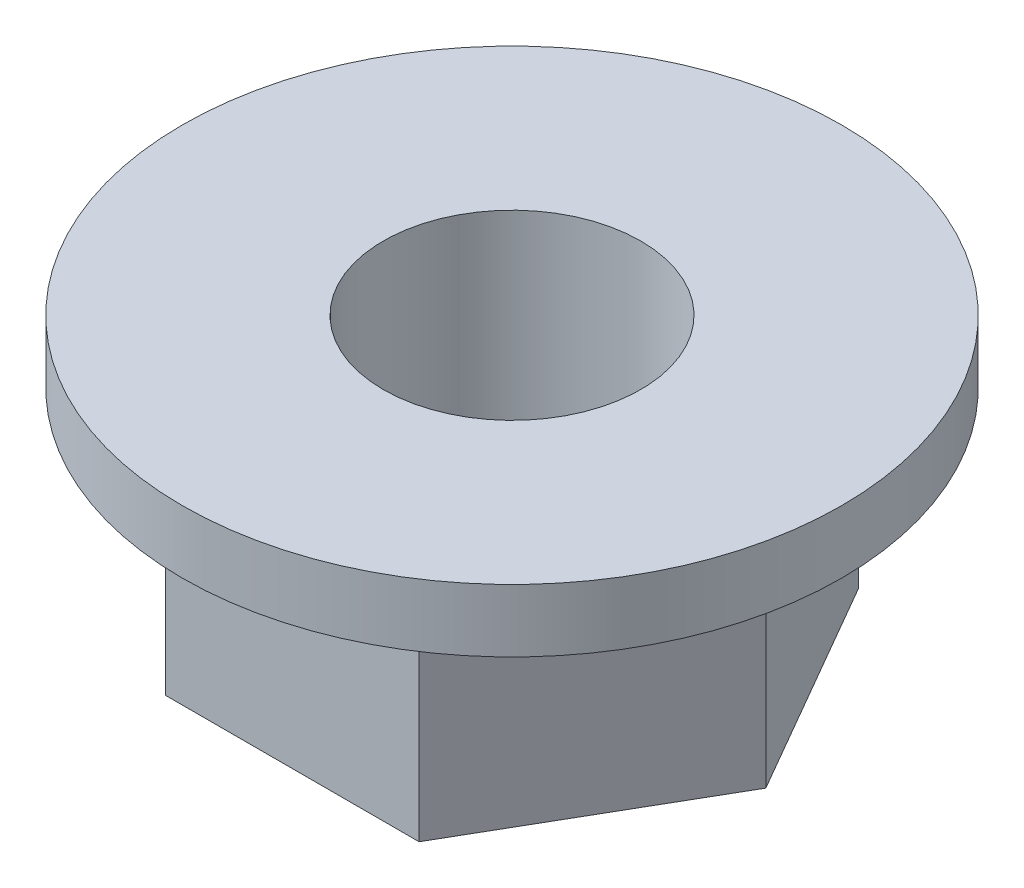
ISO-10303-21;
HEADER;
FILE_DESCRIPTION(('STEP AP214'),'2;1');
FILE_NAME('part.step','',(''),(''),'','','');
FILE_SCHEMA(('AUTOMOTIVE_DESIGN { 1 0 10303 214 1 1 1 1 }'));
ENDSEC;
DATA;
#1=APPLICATION_CONTEXT('core data for automotive mechanical design processes');
#2=APPLICATION_PROTOCOL_DEFINITION('international standard','automotive_design',2000,#1);
#3=PRODUCT_CONTEXT('',#1,'mechanical');
#4=PRODUCT('Part','Part','',(#3));
#5=PRODUCT_RELATED_PRODUCT_CATEGORY('part','',(#4));
#6=PRODUCT_DEFINITION_FORMATION('','',#4);
#7=PRODUCT_DEFINITION_CONTEXT('part definition',#1,'design');
#8=PRODUCT_DEFINITION('design','',#6,#7);
#9=PRODUCT_DEFINITION_SHAPE('','',#8);
#10=(LENGTH_UNIT() NAMED_UNIT(*) SI_UNIT(.MILLI.,.METRE.));
#11=(NAMED_UNIT(*) PLANE_ANGLE_UNIT() SI_UNIT($,.RADIAN.));
#12=(NAMED_UNIT(*) SI_UNIT($,.STERADIAN.) SOLID_ANGLE_UNIT());
#13=UNCERTAINTY_MEASURE_WITH_UNIT(LENGTH_MEASURE(1.E-05),#10,'distance_accuracy_value','');
#14=(GEOMETRIC_REPRESENTATION_CONTEXT(3) GLOBAL_UNCERTAINTY_ASSIGNED_CONTEXT((#13)) GLOBAL_UNIT_ASSIGNED_CONTEXT((#10,
#11,#12)) REPRESENTATION_CONTEXT('',''));
#15=CARTESIAN_POINT('',(0.,0.,0.));
#16=DIRECTION('',(0.,0.,1.));
#17=DIRECTION('',(1.,0.,0.));
#18=AXIS2_PLACEMENT_3D('',#15,#16,#17);
#19=CARTESIAN_POINT('',(-18.2709253038248,-135.,-3.5));
#20=DIRECTION('',(-0.866025403784438,0.,0.5));
#21=DIRECTION('',(0.5,0.,0.866025403784439));
#22=AXIS2_PLACEMENT_3D('',#19,#20,#21);
#23=PLANE('',#22);
#24=DIRECTION('',(-0.5,0.,-0.866025403784439));
#25=VECTOR('',#24,1.);
#26=CARTESIAN_POINT('',(-18.2709253038248,-138.5,-3.5));
#27=LINE('',#26,#25);
#28=CARTESIAN_POINT('',(-16.2501993616611,-138.5,0.));
#29=VERTEX_POINT('',#28);
#30=CARTESIAN_POINT('',(-18.2709253038248,-138.5,-3.5));
#31=VERTEX_POINT('',#30);
#32=EDGE_CURVE('E131',#29,#31,#27,.T.);
#33=ORIENTED_EDGE('',*,*,#32,.T.);
#34=DIRECTION('',(0.,-1.,0.));
#35=VECTOR('',#34,1.);
#36=CARTESIAN_POINT('',(-18.2709253038248,-135.,-3.5));
#37=LINE('',#36,#35);
#38=CARTESIAN_POINT('',(-18.2709253038248,-135.,-3.5));
#39=VERTEX_POINT('',#38);
#40=EDGE_CURVE('E11',#39,#31,#37,.T.);
#41=ORIENTED_EDGE('',*,*,#40,.F.);
#42=DIRECTION('',(-0.5,0.,-0.866025403784439));
#43=VECTOR('',#42,1.);
#44=CARTESIAN_POINT('',(-18.2709253038248,-135.,-3.5));
#45=LINE('',#44,#43);
#46=CARTESIAN_POINT('',(-16.2501993616611,-135.,0.));
#47=VERTEX_POINT('',#46);
#48=EDGE_CURVE('E123',#47,#39,#45,.T.);
#49=ORIENTED_EDGE('',*,*,#48,.F.);
#50=DIRECTION('',(0.,-1.,0.));
#51=VECTOR('',#50,1.);
#52=CARTESIAN_POINT('',(-16.2501993616611,-135.,0.));
#53=LINE('',#52,#51);
#54=EDGE_CURVE('E128',#47,#29,#53,.T.);
#55=ORIENTED_EDGE('',*,*,#54,.T.);
#56=EDGE_LOOP('',(#33,#41,#49,#55));
#57=FACE_BOUND('',#56,.T.);
#58=ADVANCED_FACE('F39',(#57),#23,.F.);
#59=CARTESIAN_POINT('',(-22.3123771881522,-135.,-3.5));
#60=DIRECTION('',(0.,0.,1.));
#61=DIRECTION('',(1.,0.,0.));
#62=AXIS2_PLACEMENT_3D('',#59,#60,#61);
#63=PLANE('',#62);
#64=DIRECTION('',(-1.,0.,0.));
#65=VECTOR('',#64,1.);
#66=CARTESIAN_POINT('',(-22.3123771881522,-138.5,-3.5));
#67=LINE('',#66,#65);
#68=CARTESIAN_POINT('',(-22.3123771881522,-138.5,-3.5));
#69=VERTEX_POINT('',#68);
#70=EDGE_CURVE('E133',#31,#69,#67,.T.);
#71=ORIENTED_EDGE('',*,*,#70,.T.);
#72=DIRECTION('',(0.,-1.,0.));
#73=VECTOR('',#72,1.);
#74=CARTESIAN_POINT('',(-22.3123771881522,-135.,-3.5));
#75=LINE('',#74,#73);
#76=CARTESIAN_POINT('',(-22.3123771881522,-135.,-3.5));
#77=VERTEX_POINT('',#76);
#78=EDGE_CURVE('E48',#77,#69,#75,.T.);
#79=ORIENTED_EDGE('',*,*,#78,.F.);
#80=DIRECTION('',(-1.,0.,0.));
#81=VECTOR('',#80,1.);
#82=CARTESIAN_POINT('',(-22.3123771881522,-135.,-3.5));
#83=LINE('',#82,#81);
#84=EDGE_CURVE('E95',#39,#77,#83,.T.);
#85=ORIENTED_EDGE('',*,*,#84,.F.);
#86=ORIENTED_EDGE('',*,*,#40,.T.);
#87=EDGE_LOOP('',(#71,#79,#85,#86));
#88=FACE_BOUND('',#87,.T.);
#89=ADVANCED_FACE('F178',(#88),#63,.F.);
#90=CARTESIAN_POINT('',(-24.3331031303159,-135.,0.));
#91=DIRECTION('',(0.866025403784439,0.,0.499999999999999));
#92=DIRECTION('',(0.499999999999999,0.,-0.866025403784439));
#93=AXIS2_PLACEMENT_3D('',#90,#91,#92);
#94=PLANE('',#93);
#95=DIRECTION('',(-0.499999999999999,0.,0.866025403784439));
#96=VECTOR('',#95,1.);
#97=CARTESIAN_POINT('',(-24.3331031303159,-138.5,0.));
#98=LINE('',#97,#96);
#99=CARTESIAN_POINT('',(-24.3331031303159,-138.5,0.));
#100=VERTEX_POINT('',#99);
#101=EDGE_CURVE('E110',#69,#100,#98,.T.);
#102=ORIENTED_EDGE('',*,*,#101,.T.);
#103=DIRECTION('',(0.,-1.,0.));
#104=VECTOR('',#103,1.);
#105=CARTESIAN_POINT('',(-24.3331031303159,-135.,0.));
#106=LINE('',#105,#104);
#107=CARTESIAN_POINT('',(-24.3331031303159,-135.,0.));
#108=VERTEX_POINT('',#107);
#109=EDGE_CURVE('E99',#108,#100,#106,.T.);
#110=ORIENTED_EDGE('',*,*,#109,.F.);
#111=DIRECTION('',(-0.499999999999999,0.,0.866025403784439));
#112=VECTOR('',#111,1.);
#113=CARTESIAN_POINT('',(-24.3331031303159,-135.,0.));
#114=LINE('',#113,#112);
#115=EDGE_CURVE('E104',#77,#108,#114,.T.);
#116=ORIENTED_EDGE('',*,*,#115,.F.);
#117=ORIENTED_EDGE('',*,*,#78,.T.);
#118=EDGE_LOOP('',(#102,#110,#116,#117));
#119=FACE_BOUND('',#118,.T.);
#120=ADVANCED_FACE('F105',(#119),#94,.F.);
#121=CARTESIAN_POINT('',(-22.3123771881522,-135.,3.5));
#122=DIRECTION('',(0.866025403784438,0.,-0.5));
#123=DIRECTION('',(-0.5,0.,-0.866025403784439));
#124=AXIS2_PLACEMENT_3D('',#121,#122,#123);
#125=PLANE('',#124);
#126=DIRECTION('',(0.5,0.,0.866025403784439));
#127=VECTOR('',#126,1.);
#128=CARTESIAN_POINT('',(-22.3123771881522,-138.5,3.5));
#129=LINE('',#128,#127);
#130=CARTESIAN_POINT('',(-22.3123771881522,-138.5,3.5));
#131=VERTEX_POINT('',#130);
#132=EDGE_CURVE('E138',#100,#131,#129,.T.);
#133=ORIENTED_EDGE('',*,*,#132,.T.);
#134=DIRECTION('',(0.,-1.,0.));
#135=VECTOR('',#134,1.);
#136=CARTESIAN_POINT('',(-22.3123771881522,-135.,3.5));
#137=LINE('',#136,#135);
#138=CARTESIAN_POINT('',(-22.3123771881522,-135.,3.5));
#139=VERTEX_POINT('',#138);
#140=EDGE_CURVE('E109',#139,#131,#137,.T.);
#141=ORIENTED_EDGE('',*,*,#140,.F.);
#142=DIRECTION('',(0.5,0.,0.866025403784439));
#143=VECTOR('',#142,1.);
#144=CARTESIAN_POINT('',(-22.3123771881522,-135.,3.5));
#145=LINE('',#144,#143);
#146=EDGE_CURVE('E114',#108,#139,#145,.T.);
#147=ORIENTED_EDGE('',*,*,#146,.F.);
#148=ORIENTED_EDGE('',*,*,#109,.T.);
#149=EDGE_LOOP('',(#133,#141,#147,#148));
#150=FACE_BOUND('',#149,.T.);
#151=ADVANCED_FACE('F111',(#150),#125,.F.);
#152=CARTESIAN_POINT('',(-18.2709253038248,-135.,3.5));
#153=DIRECTION('',(0.,0.,-1.));
#154=DIRECTION('',(-1.,0.,0.));
#155=AXIS2_PLACEMENT_3D('',#152,#153,#154);
#156=PLANE('',#155);
#157=DIRECTION('',(1.,0.,0.));
#158=VECTOR('',#157,1.);
#159=CARTESIAN_POINT('',(-18.2709253038248,-138.5,3.5));
#160=LINE('',#159,#158);
#161=CARTESIAN_POINT('',(-18.2709253038248,-138.5,3.5));
#162=VERTEX_POINT('',#161);
#163=EDGE_CURVE('E79',#131,#162,#160,.T.);
#164=ORIENTED_EDGE('',*,*,#163,.T.);
#165=DIRECTION('',(0.,-1.,0.));
#166=VECTOR('',#165,1.);
#167=CARTESIAN_POINT('',(-18.2709253038248,-135.,3.5));
#168=LINE('',#167,#166);
#169=CARTESIAN_POINT('',(-18.2709253038248,-135.,3.5));
#170=VERTEX_POINT('',#169);
#171=EDGE_CURVE('E57',#170,#162,#168,.T.);
#172=ORIENTED_EDGE('',*,*,#171,.F.);
#173=DIRECTION('',(1.,0.,0.));
#174=VECTOR('',#173,1.);
#175=CARTESIAN_POINT('',(-18.2709253038248,-135.,3.5));
#176=LINE('',#175,#174);
#177=EDGE_CURVE('E117',#139,#170,#176,.T.);
#178=ORIENTED_EDGE('',*,*,#177,.F.);
#179=ORIENTED_EDGE('',*,*,#140,.T.);
#180=EDGE_LOOP('',(#164,#172,#178,#179));
#181=FACE_BOUND('',#180,.T.);
#182=ADVANCED_FACE('F146',(#181),#156,.F.);
#183=CARTESIAN_POINT('',(-16.2501993616611,-135.,0.));
#184=DIRECTION('',(-0.866025403784438,0.,-0.5));
#185=DIRECTION('',(-0.5,0.,0.866025403784439));
#186=AXIS2_PLACEMENT_3D('',#183,#184,#185);
#187=PLANE('',#186);
#188=DIRECTION('',(0.5,0.,-0.866025403784439));
#189=VECTOR('',#188,1.);
#190=CARTESIAN_POINT('',(-16.2501993616611,-138.5,0.));
#191=LINE('',#190,#189);
#192=EDGE_CURVE('E84',#162,#29,#191,.T.);
#193=ORIENTED_EDGE('',*,*,#192,.T.);
#194=ORIENTED_EDGE('',*,*,#54,.F.);
#195=DIRECTION('',(0.5,0.,-0.866025403784439));
#196=VECTOR('',#195,1.);
#197=CARTESIAN_POINT('',(-16.2501993616611,-135.,0.));
#198=LINE('',#197,#196);
#199=EDGE_CURVE('E126',#170,#47,#198,.T.);
#200=ORIENTED_EDGE('',*,*,#199,.F.);
#201=ORIENTED_EDGE('',*,*,#171,.T.);
#202=EDGE_LOOP('',(#193,#194,#200,#201));
#203=FACE_BOUND('',#202,.T.);
#204=ADVANCED_FACE('F147',(#203),#187,.F.);
#205=CARTESIAN_POINT('',(0.,-138.5,0.));
#206=DIRECTION('',(0.,-1.,0.));
#207=DIRECTION('',(0.,0.,-1.));
#208=AXIS2_PLACEMENT_3D('',#205,#206,#207);
#209=PLANE('',#208);
#210=CARTESIAN_POINT('',(-20.2916512459885,-138.5,0.));
#211=DIRECTION('',(0.,-1.,0.));
#212=DIRECTION('',(0.,0.,-1.));
#213=AXIS2_PLACEMENT_3D('',#210,#211,#212);
#214=CIRCLE('',#213,2.05);
#215=CARTESIAN_POINT('',(-20.2916512459885,-138.5,-2.05));
#216=VERTEX_POINT('',#215);
#217=EDGE_CURVE('E156',#216,#216,#214,.F.);
#218=ORIENTED_EDGE('',*,*,#217,.T.);
#219=EDGE_LOOP('',(#218));
#220=FACE_BOUND('',#219,.T.);
#221=ORIENTED_EDGE('',*,*,#32,.F.);
#222=ORIENTED_EDGE('',*,*,#192,.F.);
#223=ORIENTED_EDGE('',*,*,#163,.F.);
#224=ORIENTED_EDGE('',*,*,#132,.F.);
#225=ORIENTED_EDGE('',*,*,#101,.F.);
#226=ORIENTED_EDGE('',*,*,#70,.F.);
#227=EDGE_LOOP('',(#221,#222,#223,#224,#225,#226));
#228=FACE_BOUND('',#227,.T.);
#229=ADVANCED_FACE('F150',(#220,#228),#209,.T.);
#230=CARTESIAN_POINT('',(-20.2916512459885,-135.,0.));
#231=DIRECTION('',(0.,1.,0.));
#232=DIRECTION('',(0.,0.,1.));
#233=AXIS2_PLACEMENT_3D('',#230,#231,#232);
#234=PLANE('',#233);
#235=CARTESIAN_POINT('',(-20.2916512459885,-135.,0.));
#236=DIRECTION('',(0.,1.,0.));
#237=DIRECTION('',(0.,0.,1.));
#238=AXIS2_PLACEMENT_3D('',#235,#236,#237);
#239=CIRCLE('',#238,5.25);
#240=CARTESIAN_POINT('',(-20.2916512459885,-135.,5.25));
#241=VERTEX_POINT('',#240);
#242=EDGE_CURVE('E153',#241,#241,#239,.T.);
#243=ORIENTED_EDGE('',*,*,#242,.F.);
#244=EDGE_LOOP('',(#243));
#245=FACE_BOUND('',#244,.T.);
#246=ORIENTED_EDGE('',*,*,#199,.T.);
#247=ORIENTED_EDGE('',*,*,#48,.T.);
#248=ORIENTED_EDGE('',*,*,#84,.T.);
#249=ORIENTED_EDGE('',*,*,#115,.T.);
#250=ORIENTED_EDGE('',*,*,#146,.T.);
#251=ORIENTED_EDGE('',*,*,#177,.T.);
#252=EDGE_LOOP('',(#246,#247,#248,#249,#250,#251));
#253=FACE_BOUND('',#252,.T.);
#254=ADVANCED_FACE('F120',(#245,#253),#234,.F.);
#255=CARTESIAN_POINT('',(-20.2916512459885,-134.,0.));
#256=DIRECTION('',(0.,-1.,0.));
#257=DIRECTION('',(0.,0.,-1.));
#258=AXIS2_PLACEMENT_3D('',#255,#256,#257);
#259=CYLINDRICAL_SURFACE('',#258,5.25);
#260=CARTESIAN_POINT('',(-20.2916512459885,-134.,0.));
#261=DIRECTION('',(0.,1.,0.));
#262=DIRECTION('',(0.,0.,1.));
#263=AXIS2_PLACEMENT_3D('',#260,#261,#262);
#264=CIRCLE('',#263,5.25);
#265=CARTESIAN_POINT('',(-20.2916512459885,-134.,5.25));
#266=VERTEX_POINT('',#265);
#267=EDGE_CURVE('E135',#266,#266,#264,.T.);
#268=ORIENTED_EDGE('',*,*,#267,.F.);
#269=EDGE_LOOP('',(#268));
#270=FACE_BOUND('',#269,.T.);
#271=ORIENTED_EDGE('',*,*,#242,.T.);
#272=EDGE_LOOP('',(#271));
#273=FACE_BOUND('',#272,.T.);
#274=ADVANCED_FACE('F175',(#270,#273),#259,.T.);
#275=CARTESIAN_POINT('',(-20.2916512459885,-134.,0.));
#276=DIRECTION('',(0.,1.,0.));
#277=DIRECTION('',(0.,0.,1.));
#278=AXIS2_PLACEMENT_3D('',#275,#276,#277);
#279=PLANE('',#278);
#280=CARTESIAN_POINT('',(-20.2916512459885,-134.,0.));
#281=DIRECTION('',(0.,1.,0.));
#282=DIRECTION('',(0.,0.,1.));
#283=AXIS2_PLACEMENT_3D('',#280,#281,#282);
#284=CIRCLE('',#283,2.05);
#285=CARTESIAN_POINT('',(-20.2916512459885,-134.,2.05));
#286=VERTEX_POINT('',#285);
#287=EDGE_CURVE('E45',#286,#286,#284,.F.);
#288=ORIENTED_EDGE('',*,*,#287,.T.);
#289=EDGE_LOOP('',(#288));
#290=FACE_BOUND('',#289,.T.);
#291=ORIENTED_EDGE('',*,*,#267,.T.);
#292=EDGE_LOOP('',(#291));
#293=FACE_BOUND('',#292,.T.);
#294=ADVANCED_FACE('F164',(#290,#293),#279,.T.);
#295=CARTESIAN_POINT('',(-20.2916512459885,-133.9,0.));
#296=DIRECTION('',(0.,-1.,0.));
#297=DIRECTION('',(0.,0.,-1.));
#298=AXIS2_PLACEMENT_3D('',#295,#296,#297);
#299=CYLINDRICAL_SURFACE('',#298,2.05);
#300=ORIENTED_EDGE('',*,*,#217,.F.);
#301=EDGE_LOOP('',(#300));
#302=FACE_BOUND('',#301,.T.);
#303=ORIENTED_EDGE('',*,*,#287,.F.);
#304=EDGE_LOOP('',(#303));
#305=FACE_BOUND('',#304,.T.);
#306=ADVANCED_FACE('F169',(#302,#305),#299,.F.);
#307=CLOSED_SHELL('',(#58,#89,#120,#151,#182,#204,#229,#254,#274,#294,#306));
#308=MANIFOLD_SOLID_BREP('B2',#307);
#309=ADVANCED_BREP_SHAPE_REPRESENTATION('',(#18,#308),#14);
#310=SHAPE_DEFINITION_REPRESENTATION(#9,#309);
ENDSEC;
END-ISO-10303-21;
